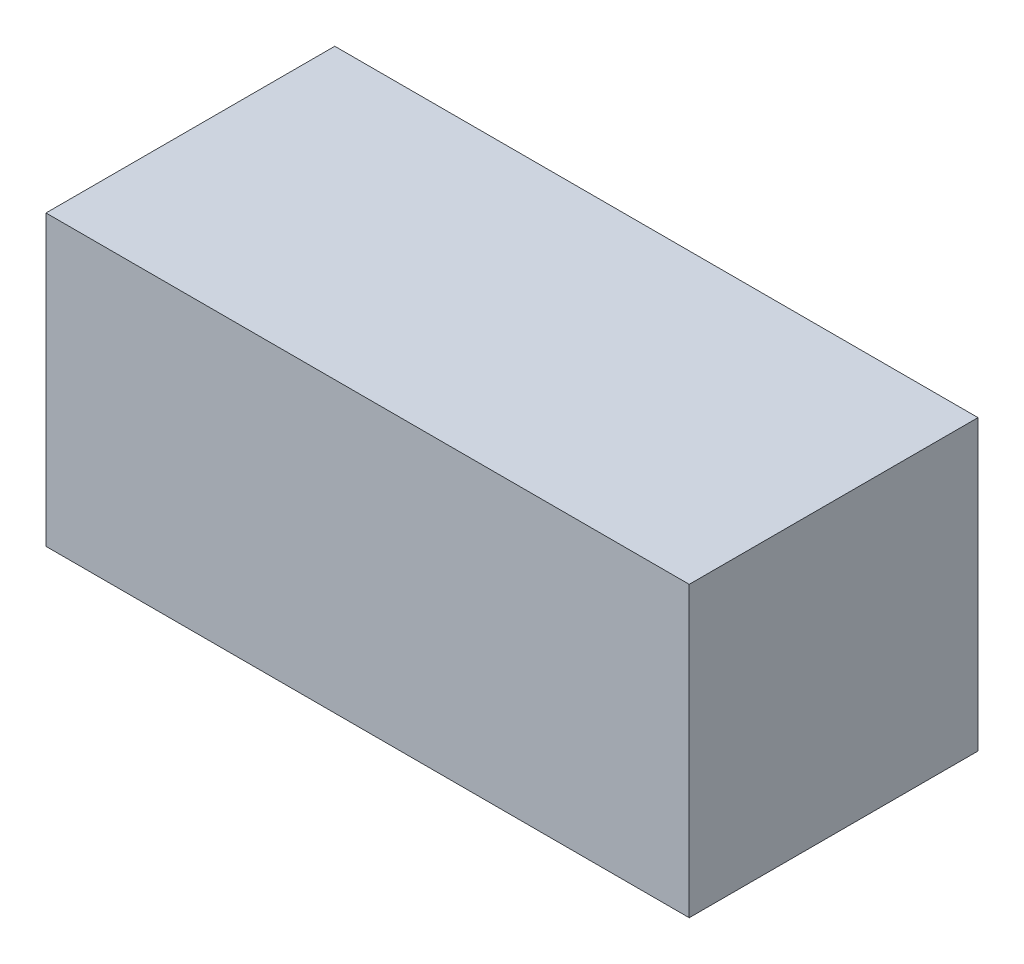
ISO-10303-21;
HEADER;
FILE_DESCRIPTION(('STEP AP214'),'2;1');
FILE_NAME('part.step','',(''),(''),'','','');
FILE_SCHEMA(('AUTOMOTIVE_DESIGN { 1 0 10303 214 1 1 1 1 }'));
ENDSEC;
DATA;
#1=APPLICATION_CONTEXT('core data for automotive mechanical design processes');
#2=APPLICATION_PROTOCOL_DEFINITION('international standard','automotive_design',2000,#1);
#3=PRODUCT_CONTEXT('',#1,'mechanical');
#4=PRODUCT('Part','Part','',(#3));
#5=PRODUCT_RELATED_PRODUCT_CATEGORY('part','',(#4));
#6=PRODUCT_DEFINITION_FORMATION('','',#4);
#7=PRODUCT_DEFINITION_CONTEXT('part definition',#1,'design');
#8=PRODUCT_DEFINITION('design','',#6,#7);
#9=PRODUCT_DEFINITION_SHAPE('','',#8);
#10=(LENGTH_UNIT() NAMED_UNIT(*) SI_UNIT(.MILLI.,.METRE.));
#11=(NAMED_UNIT(*) PLANE_ANGLE_UNIT() SI_UNIT($,.RADIAN.));
#12=(NAMED_UNIT(*) SI_UNIT($,.STERADIAN.) SOLID_ANGLE_UNIT());
#13=UNCERTAINTY_MEASURE_WITH_UNIT(LENGTH_MEASURE(1.E-05),#10,'distance_accuracy_value','');
#14=(GEOMETRIC_REPRESENTATION_CONTEXT(3) GLOBAL_UNCERTAINTY_ASSIGNED_CONTEXT((#13)) GLOBAL_UNIT_ASSIGNED_CONTEXT((#10,
#11,#12)) REPRESENTATION_CONTEXT('',''));
#15=CARTESIAN_POINT('',(0.,0.,0.));
#16=DIRECTION('',(0.,0.,1.));
#17=DIRECTION('',(1.,0.,0.));
#18=AXIS2_PLACEMENT_3D('',#15,#16,#17);
#19=CARTESIAN_POINT('',(-1.1125,-0.5,1.));
#20=DIRECTION('',(1.,0.,0.));
#21=DIRECTION('',(0.,0.,-1.));
#22=AXIS2_PLACEMENT_3D('',#19,#20,#21);
#23=PLANE('',#22);
#24=DIRECTION('',(0.,-1.,0.));
#25=VECTOR('',#24,1.);
#26=CARTESIAN_POINT('',(-1.1125,-0.5,0.));
#27=LINE('',#26,#25);
#28=CARTESIAN_POINT('',(-1.1125,0.5,0.));
#29=VERTEX_POINT('',#28);
#30=CARTESIAN_POINT('',(-1.1125,-0.5,0.));
#31=VERTEX_POINT('',#30);
#32=EDGE_CURVE('E97',#29,#31,#27,.T.);
#33=ORIENTED_EDGE('',*,*,#32,.T.);
#34=DIRECTION('',(0.,0.,-1.));
#35=VECTOR('',#34,1.);
#36=CARTESIAN_POINT('',(-1.1125,-0.5,1.));
#37=LINE('',#36,#35);
#38=CARTESIAN_POINT('',(-1.1125,-0.5,1.));
#39=VERTEX_POINT('',#38);
#40=EDGE_CURVE('E11',#39,#31,#37,.T.);
#41=ORIENTED_EDGE('',*,*,#40,.F.);
#42=DIRECTION('',(0.,-1.,0.));
#43=VECTOR('',#42,1.);
#44=CARTESIAN_POINT('',(-1.1125,-0.5,1.));
#45=LINE('',#44,#43);
#46=CARTESIAN_POINT('',(-1.1125,0.5,1.));
#47=VERTEX_POINT('',#46);
#48=EDGE_CURVE('E85',#47,#39,#45,.T.);
#49=ORIENTED_EDGE('',*,*,#48,.F.);
#50=DIRECTION('',(0.,0.,-1.));
#51=VECTOR('',#50,1.);
#52=CARTESIAN_POINT('',(-1.1125,0.5,1.));
#53=LINE('',#52,#51);
#54=EDGE_CURVE('E93',#47,#29,#53,.T.);
#55=ORIENTED_EDGE('',*,*,#54,.T.);
#56=EDGE_LOOP('',(#33,#41,#49,#55));
#57=FACE_BOUND('',#56,.T.);
#58=ADVANCED_FACE('F34',(#57),#23,.F.);
#59=CARTESIAN_POINT('',(1.115,-0.5,1.));
#60=DIRECTION('',(0.,1.,0.));
#61=DIRECTION('',(0.,0.,1.));
#62=AXIS2_PLACEMENT_3D('',#59,#60,#61);
#63=PLANE('',#62);
#64=DIRECTION('',(1.,0.,0.));
#65=VECTOR('',#64,1.);
#66=CARTESIAN_POINT('',(1.115,-0.5,0.));
#67=LINE('',#66,#65);
#68=CARTESIAN_POINT('',(1.115,-0.5,0.));
#69=VERTEX_POINT('',#68);
#70=EDGE_CURVE('E89',#31,#69,#67,.T.);
#71=ORIENTED_EDGE('',*,*,#70,.T.);
#72=DIRECTION('',(0.,0.,-1.));
#73=VECTOR('',#72,1.);
#74=CARTESIAN_POINT('',(1.115,-0.5,1.));
#75=LINE('',#74,#73);
#76=CARTESIAN_POINT('',(1.115,-0.5,1.));
#77=VERTEX_POINT('',#76);
#78=EDGE_CURVE('E42',#77,#69,#75,.T.);
#79=ORIENTED_EDGE('',*,*,#78,.F.);
#80=DIRECTION('',(1.,0.,0.));
#81=VECTOR('',#80,1.);
#82=CARTESIAN_POINT('',(1.115,-0.5,1.));
#83=LINE('',#82,#81);
#84=EDGE_CURVE('E80',#39,#77,#83,.T.);
#85=ORIENTED_EDGE('',*,*,#84,.F.);
#86=ORIENTED_EDGE('',*,*,#40,.T.);
#87=EDGE_LOOP('',(#71,#79,#85,#86));
#88=FACE_BOUND('',#87,.T.);
#89=ADVANCED_FACE('F88',(#88),#63,.F.);
#90=CARTESIAN_POINT('',(1.115,0.5,1.));
#91=DIRECTION('',(-1.,0.,0.));
#92=DIRECTION('',(0.,0.,1.));
#93=AXIS2_PLACEMENT_3D('',#90,#91,#92);
#94=PLANE('',#93);
#95=DIRECTION('',(0.,1.,0.));
#96=VECTOR('',#95,1.);
#97=CARTESIAN_POINT('',(1.115,0.5,0.));
#98=LINE('',#97,#96);
#99=CARTESIAN_POINT('',(1.115,0.5,0.));
#100=VERTEX_POINT('',#99);
#101=EDGE_CURVE('E67',#69,#100,#98,.T.);
#102=ORIENTED_EDGE('',*,*,#101,.T.);
#103=DIRECTION('',(0.,0.,-1.));
#104=VECTOR('',#103,1.);
#105=CARTESIAN_POINT('',(1.115,0.5,1.));
#106=LINE('',#105,#104);
#107=CARTESIAN_POINT('',(1.115,0.5,1.));
#108=VERTEX_POINT('',#107);
#109=EDGE_CURVE('E90',#108,#100,#106,.T.);
#110=ORIENTED_EDGE('',*,*,#109,.F.);
#111=DIRECTION('',(0.,1.,0.));
#112=VECTOR('',#111,1.);
#113=CARTESIAN_POINT('',(1.115,0.5,1.));
#114=LINE('',#113,#112);
#115=EDGE_CURVE('E83',#77,#108,#114,.T.);
#116=ORIENTED_EDGE('',*,*,#115,.F.);
#117=ORIENTED_EDGE('',*,*,#78,.T.);
#118=EDGE_LOOP('',(#102,#110,#116,#117));
#119=FACE_BOUND('',#118,.T.);
#120=ADVANCED_FACE('F91',(#119),#94,.F.);
#121=CARTESIAN_POINT('',(-1.1125,0.5,1.));
#122=DIRECTION('',(0.,-1.,0.));
#123=DIRECTION('',(0.,0.,-1.));
#124=AXIS2_PLACEMENT_3D('',#121,#122,#123);
#125=PLANE('',#124);
#126=DIRECTION('',(-1.,0.,0.));
#127=VECTOR('',#126,1.);
#128=CARTESIAN_POINT('',(-1.1125,0.5,0.));
#129=LINE('',#128,#127);
#130=EDGE_CURVE('E73',#100,#29,#129,.T.);
#131=ORIENTED_EDGE('',*,*,#130,.T.);
#132=ORIENTED_EDGE('',*,*,#54,.F.);
#133=DIRECTION('',(-1.,0.,0.));
#134=VECTOR('',#133,1.);
#135=CARTESIAN_POINT('',(-1.1125,0.5,1.));
#136=LINE('',#135,#134);
#137=EDGE_CURVE('E50',#108,#47,#136,.T.);
#138=ORIENTED_EDGE('',*,*,#137,.F.);
#139=ORIENTED_EDGE('',*,*,#109,.T.);
#140=EDGE_LOOP('',(#131,#132,#138,#139));
#141=FACE_BOUND('',#140,.T.);
#142=ADVANCED_FACE('F104',(#141),#125,.F.);
#143=CARTESIAN_POINT('',(0.,0.,1.));
#144=DIRECTION('',(0.,0.,-1.));
#145=DIRECTION('',(-1.,0.,0.));
#146=AXIS2_PLACEMENT_3D('',#143,#144,#145);
#147=PLANE('',#146);
#148=ORIENTED_EDGE('',*,*,#48,.T.);
#149=ORIENTED_EDGE('',*,*,#84,.T.);
#150=ORIENTED_EDGE('',*,*,#115,.T.);
#151=ORIENTED_EDGE('',*,*,#137,.T.);
#152=EDGE_LOOP('',(#148,#149,#150,#151));
#153=FACE_BOUND('',#152,.T.);
#154=ADVANCED_FACE('F81',(#153),#147,.F.);
#155=CARTESIAN_POINT('',(0.,0.,0.));
#156=DIRECTION('',(0.,0.,-1.));
#157=DIRECTION('',(-1.,0.,0.));
#158=AXIS2_PLACEMENT_3D('',#155,#156,#157);
#159=PLANE('',#158);
#160=ORIENTED_EDGE('',*,*,#32,.F.);
#161=ORIENTED_EDGE('',*,*,#130,.F.);
#162=ORIENTED_EDGE('',*,*,#101,.F.);
#163=ORIENTED_EDGE('',*,*,#70,.F.);
#164=EDGE_LOOP('',(#160,#161,#162,#163));
#165=FACE_BOUND('',#164,.T.);
#166=ADVANCED_FACE('F107',(#165),#159,.T.);
#167=CLOSED_SHELL('',(#58,#89,#120,#142,#154,#166));
#168=MANIFOLD_SOLID_BREP('B2',#167);
#169=ADVANCED_BREP_SHAPE_REPRESENTATION('',(#18,#168),#14);
#170=SHAPE_DEFINITION_REPRESENTATION(#9,#169);
ENDSEC;
END-ISO-10303-21;
